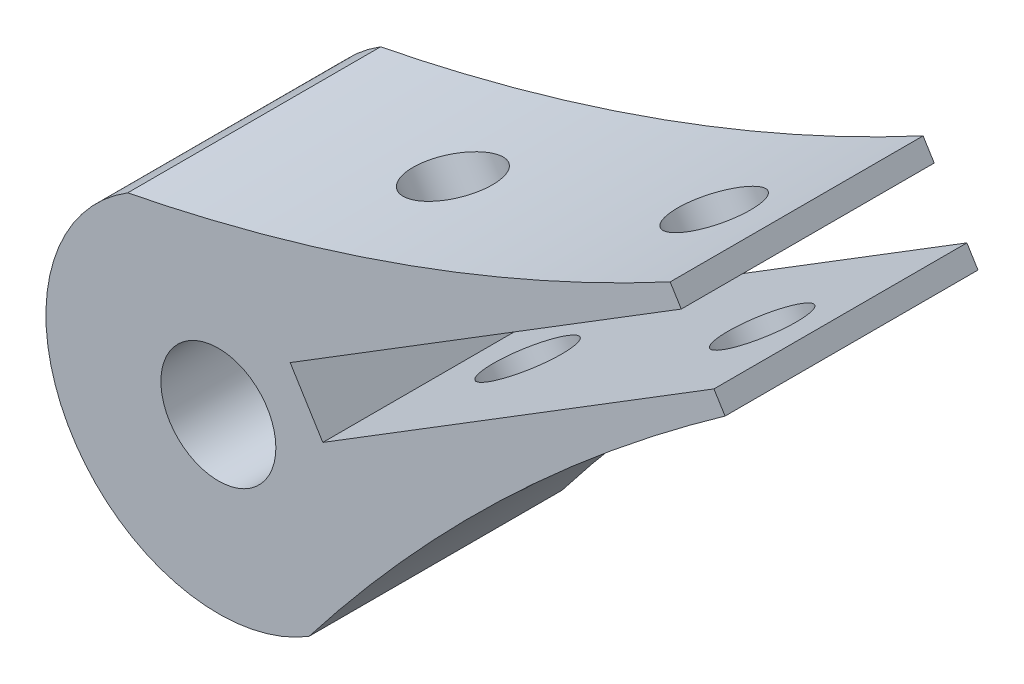
ISO-10303-21;
HEADER;
FILE_DESCRIPTION(('STEP AP214'),'2;1');
FILE_NAME('part.step','',(''),(''),'','','');
FILE_SCHEMA(('AUTOMOTIVE_DESIGN { 1 0 10303 214 1 1 1 1 }'));
ENDSEC;
DATA;
#1=APPLICATION_CONTEXT('core data for automotive mechanical design processes');
#2=APPLICATION_PROTOCOL_DEFINITION('international standard','automotive_design',2000,#1);
#3=PRODUCT_CONTEXT('',#1,'mechanical');
#4=PRODUCT('Part','Part','',(#3));
#5=PRODUCT_RELATED_PRODUCT_CATEGORY('part','',(#4));
#6=PRODUCT_DEFINITION_FORMATION('','',#4);
#7=PRODUCT_DEFINITION_CONTEXT('part definition',#1,'design');
#8=PRODUCT_DEFINITION('design','',#6,#7);
#9=PRODUCT_DEFINITION_SHAPE('','',#8);
#10=(LENGTH_UNIT() NAMED_UNIT(*) SI_UNIT(.MILLI.,.METRE.));
#11=(NAMED_UNIT(*) PLANE_ANGLE_UNIT() SI_UNIT($,.RADIAN.));
#12=(NAMED_UNIT(*) SI_UNIT($,.STERADIAN.) SOLID_ANGLE_UNIT());
#13=UNCERTAINTY_MEASURE_WITH_UNIT(LENGTH_MEASURE(1.E-05),#10,'distance_accuracy_value','');
#14=(GEOMETRIC_REPRESENTATION_CONTEXT(3) GLOBAL_UNCERTAINTY_ASSIGNED_CONTEXT((#13)) GLOBAL_UNIT_ASSIGNED_CONTEXT((#10,
#11,#12)) REPRESENTATION_CONTEXT('',''));
#15=CARTESIAN_POINT('',(0.,0.,0.));
#16=DIRECTION('',(0.,0.,1.));
#17=DIRECTION('',(1.,0.,0.));
#18=AXIS2_PLACEMENT_3D('',#15,#16,#17);
#19=CARTESIAN_POINT('',(8.17278399741559,9.72023727549129,11.));
#20=DIRECTION('',(0.,0.,-1.));
#21=DIRECTION('',(-1.,0.,0.));
#22=AXIS2_PLACEMENT_3D('',#19,#20,#21);
#23=PLANE('',#22);
#24=DIRECTION('',(-0.850473719865916,-0.526017539457984,0.));
#25=VECTOR('',#24,1.);
#26=CARTESIAN_POINT('',(21.5517653165876,11.7424046499424,11.));
#27=LINE('',#26,#25);
#28=CARTESIAN_POINT('',(21.5517653165876,11.7424046499424,11.));
#29=VERTEX_POINT('',#28);
#30=CARTESIAN_POINT('',(4.5422909192693,1.22205386078271,11.));
#31=VERTEX_POINT('',#30);
#32=EDGE_CURVE('E206',#29,#31,#27,.T.);
#33=ORIENTED_EDGE('',*,*,#32,.T.);
#34=DIRECTION('',(-0.526017539457984,0.850473719865916,0.));
#35=VECTOR('',#34,1.);
#36=CARTESIAN_POINT('',(3.12204356273275,3.51833290442068,11.));
#37=LINE('',#36,#35);
#38=CARTESIAN_POINT('',(3.12204356273275,3.51833290442068,11.));
#39=VERTEX_POINT('',#38);
#40=EDGE_CURVE('E107',#31,#39,#37,.T.);
#41=ORIENTED_EDGE('',*,*,#40,.T.);
#42=DIRECTION('',(0.850473719865916,0.526017539457984,0.));
#43=VECTOR('',#42,1.);
#44=CARTESIAN_POINT('',(20.1315179600511,14.0386836935804,11.));
#45=LINE('',#44,#43);
#46=CARTESIAN_POINT('',(20.1315179600511,14.0386836935804,11.));
#47=VERTEX_POINT('',#46);
#48=EDGE_CURVE('E203',#39,#47,#45,.T.);
#49=ORIENTED_EDGE('',*,*,#48,.T.);
#50=DIRECTION('',(-0.526017539457984,0.850473719865916,0.));
#51=VECTOR('',#50,1.);
#52=CARTESIAN_POINT('',(19.6477702099956,14.8208149299083,11.));
#53=LINE('',#52,#51);
#54=CARTESIAN_POINT('',(19.6477702099956,14.8208149299083,11.));
#55=VERTEX_POINT('',#54);
#56=EDGE_CURVE('E198',#47,#55,#53,.T.);
#57=ORIENTED_EDGE('',*,*,#56,.T.);
#58=CARTESIAN_POINT('',(19.6477702099956,14.8208149299083,11.));
#59=CARTESIAN_POINT('',(8.49425791636496,8.84079635987424,11.));
#60=CARTESIAN_POINT('',(-3.94515005306311,6.37854145230835,11.));
#61=B_SPLINE_CURVE_WITH_KNOTS('',2,(#58,#59,#60),.UNSPECIFIED.,.F.,.F.,(3,3),(0.,1.),.UNSPECIFIED.);
#62=CARTESIAN_POINT('',(-3.94515005306311,6.37854145230835,11.));
#63=VERTEX_POINT('',#62);
#64=EDGE_CURVE('E126',#55,#63,#61,.T.);
#65=ORIENTED_EDGE('',*,*,#64,.T.);
#66=CARTESIAN_POINT('',(-1.85071448418131E-05,-1.14466591639301E-05,11.));
#67=DIRECTION('',(0.,0.,1.));
#68=DIRECTION('',(1.,0.,0.));
#69=AXIS2_PLACEMENT_3D('',#66,#67,#68);
#70=CIRCLE('',#69,7.49999999996843);
#71=CARTESIAN_POINT('',(3.94511303877343,-6.37856434562668,11.));
#72=VERTEX_POINT('',#71);
#73=EDGE_CURVE('E120',#63,#72,#70,.T.);
#74=ORIENTED_EDGE('',*,*,#73,.T.);
#75=CARTESIAN_POINT('',(3.94511303877343,-6.37856434562668,11.));
#76=CARTESIAN_POINT('',(11.7037395394991,3.65165423035361,11.));
#77=CARTESIAN_POINT('',(22.0355130666431,10.9602734136144,11.));
#78=B_SPLINE_CURVE_WITH_KNOTS('',2,(#75,#76,#77),.UNSPECIFIED.,.F.,.F.,(3,3),(0.,1.),.UNSPECIFIED.);
#79=CARTESIAN_POINT('',(22.0355130666431,10.9602734136144,11.));
#80=VERTEX_POINT('',#79);
#81=EDGE_CURVE('E124',#72,#80,#78,.T.);
#82=ORIENTED_EDGE('',*,*,#81,.T.);
#83=DIRECTION('',(-0.526017539457977,0.85047371986592,0.));
#84=VECTOR('',#83,1.);
#85=CARTESIAN_POINT('',(22.0355130666431,10.9602734136144,11.));
#86=LINE('',#85,#84);
#87=EDGE_CURVE('E64',#80,#29,#86,.T.);
#88=ORIENTED_EDGE('',*,*,#87,.T.);
#89=EDGE_LOOP('',(#33,#41,#49,#57,#65,#74,#82,#88));
#90=FACE_BOUND('',#89,.T.);
#91=CARTESIAN_POINT('',(-1.85071448418131E-05,-1.14466591639301E-05,11.));
#92=DIRECTION('',(0.,0.,1.));
#93=DIRECTION('',(1.,0.,0.));
#94=AXIS2_PLACEMENT_3D('',#91,#92,#93);
#95=CIRCLE('',#94,2.5);
#96=CARTESIAN_POINT('',(2.49998149285516,-1.14466591639301E-05,11.));
#97=VERTEX_POINT('',#96);
#98=EDGE_CURVE('E211',#97,#97,#95,.T.);
#99=ORIENTED_EDGE('',*,*,#98,.F.);
#100=EDGE_LOOP('',(#99));
#101=FACE_BOUND('',#100,.T.);
#102=ADVANCED_FACE('F40',(#90,#101),#23,.F.);
#103=CARTESIAN_POINT('',(8.17278399741559,9.72023727549129,0.));
#104=DIRECTION('',(0.,0.,-1.));
#105=DIRECTION('',(-1.,0.,0.));
#106=AXIS2_PLACEMENT_3D('',#103,#104,#105);
#107=PLANE('',#106);
#108=DIRECTION('',(-0.850473719865916,-0.526017539457984,0.));
#109=VECTOR('',#108,1.);
#110=CARTESIAN_POINT('',(21.5517653165876,11.7424046499424,0.));
#111=LINE('',#110,#109);
#112=CARTESIAN_POINT('',(21.5517653165876,11.7424046499424,0.));
#113=VERTEX_POINT('',#112);
#114=CARTESIAN_POINT('',(4.5422909192693,1.22205386078271,0.));
#115=VERTEX_POINT('',#114);
#116=EDGE_CURVE('E215',#113,#115,#111,.T.);
#117=ORIENTED_EDGE('',*,*,#116,.F.);
#118=DIRECTION('',(-0.526017539457977,0.85047371986592,0.));
#119=VECTOR('',#118,1.);
#120=CARTESIAN_POINT('',(22.0355130666431,10.9602734136144,0.));
#121=LINE('',#120,#119);
#122=CARTESIAN_POINT('',(22.0355130666431,10.9602734136144,0.));
#123=VERTEX_POINT('',#122);
#124=EDGE_CURVE('E99',#123,#113,#121,.T.);
#125=ORIENTED_EDGE('',*,*,#124,.F.);
#126=CARTESIAN_POINT('',(3.94511303877343,-6.37856434562668,0.));
#127=CARTESIAN_POINT('',(11.7037395394991,3.65165423035361,0.));
#128=CARTESIAN_POINT('',(22.0355130666431,10.9602734136144,0.));
#129=B_SPLINE_CURVE_WITH_KNOTS('',2,(#126,#127,#128),.UNSPECIFIED.,.F.,.F.,(3,3),(0.,1.),.UNSPECIFIED.);
#130=CARTESIAN_POINT('',(3.94511303877343,-6.37856434562668,0.));
#131=VERTEX_POINT('',#130);
#132=EDGE_CURVE('E93',#131,#123,#129,.T.);
#133=ORIENTED_EDGE('',*,*,#132,.F.);
#134=CARTESIAN_POINT('',(-1.85071448418131E-05,-1.14466591639301E-05,0.));
#135=DIRECTION('',(0.,0.,1.));
#136=DIRECTION('',(1.,0.,0.));
#137=AXIS2_PLACEMENT_3D('',#134,#135,#136);
#138=CIRCLE('',#137,7.49999999996843);
#139=CARTESIAN_POINT('',(-3.94515005306311,6.37854145230835,0.));
#140=VERTEX_POINT('',#139);
#141=EDGE_CURVE('E134',#140,#131,#138,.T.);
#142=ORIENTED_EDGE('',*,*,#141,.F.);
#143=CARTESIAN_POINT('',(19.6477702099956,14.8208149299083,0.));
#144=CARTESIAN_POINT('',(8.49425791636496,8.84079635987424,0.));
#145=CARTESIAN_POINT('',(-3.94515005306311,6.37854145230835,0.));
#146=B_SPLINE_CURVE_WITH_KNOTS('',2,(#143,#144,#145),.UNSPECIFIED.,.F.,.F.,(3,3),(0.,1.),.UNSPECIFIED.);
#147=CARTESIAN_POINT('',(19.6477702099956,14.8208149299083,0.));
#148=VERTEX_POINT('',#147);
#149=EDGE_CURVE('E401',#148,#140,#146,.T.);
#150=ORIENTED_EDGE('',*,*,#149,.F.);
#151=DIRECTION('',(-0.526017539457984,0.850473719865916,0.));
#152=VECTOR('',#151,1.);
#153=CARTESIAN_POINT('',(19.6477702099956,14.8208149299083,0.));
#154=LINE('',#153,#152);
#155=CARTESIAN_POINT('',(20.1315179600511,14.0386836935804,0.));
#156=VERTEX_POINT('',#155);
#157=EDGE_CURVE('E399',#156,#148,#154,.T.);
#158=ORIENTED_EDGE('',*,*,#157,.F.);
#159=DIRECTION('',(0.850473719865916,0.526017539457984,0.));
#160=VECTOR('',#159,1.);
#161=CARTESIAN_POINT('',(20.1315179600511,14.0386836935804,0.));
#162=LINE('',#161,#160);
#163=CARTESIAN_POINT('',(3.12204356273275,3.51833290442068,0.));
#164=VERTEX_POINT('',#163);
#165=EDGE_CURVE('E392',#164,#156,#162,.T.);
#166=ORIENTED_EDGE('',*,*,#165,.F.);
#167=DIRECTION('',(-0.526017539457984,0.850473719865916,0.));
#168=VECTOR('',#167,1.);
#169=CARTESIAN_POINT('',(3.12204356273275,3.51833290442068,0.));
#170=LINE('',#169,#168);
#171=EDGE_CURVE('E387',#115,#164,#170,.T.);
#172=ORIENTED_EDGE('',*,*,#171,.F.);
#173=EDGE_LOOP('',(#117,#125,#133,#142,#150,#158,#166,#172));
#174=FACE_BOUND('',#173,.T.);
#175=CARTESIAN_POINT('',(-1.85071448418131E-05,-1.14466591639301E-05,0.));
#176=DIRECTION('',(0.,0.,1.));
#177=DIRECTION('',(1.,0.,0.));
#178=AXIS2_PLACEMENT_3D('',#175,#176,#177);
#179=CIRCLE('',#178,2.5);
#180=CARTESIAN_POINT('',(2.49998149285516,-1.14466591639301E-05,0.));
#181=VERTEX_POINT('',#180);
#182=EDGE_CURVE('E208',#181,#181,#179,.T.);
#183=ORIENTED_EDGE('',*,*,#182,.T.);
#184=EDGE_LOOP('',(#183));
#185=FACE_BOUND('',#184,.T.);
#186=ADVANCED_FACE('F248',(#174,#185),#107,.T.);
#187=CARTESIAN_POINT('',(21.5517653165876,11.7424046499424,11.));
#188=DIRECTION('',(0.526017539457984,-0.850473719865916,0.));
#189=DIRECTION('',(0.850473719865916,0.526017539457984,0.));
#190=AXIS2_PLACEMENT_3D('',#187,#188,#189);
#191=PLANE('',#190);
#192=CARTESIAN_POINT('',(7.94418579873295,3.32612401861464,5.5));
#193=DIRECTION('',(0.526017539457984,-0.850473719865916,0.));
#194=DIRECTION('',(0.850473719865916,0.526017539457984,0.));
#195=AXIS2_PLACEMENT_3D('',#192,#193,#194);
#196=CIRCLE('',#195,1.75);
#197=CARTESIAN_POINT('',(9.43251480849831,4.24665471266611,5.5));
#198=VERTEX_POINT('',#197);
#199=EDGE_CURVE('E212',#198,#198,#196,.T.);
#200=ORIENTED_EDGE('',*,*,#199,.T.);
#201=EDGE_LOOP('',(#200));
#202=FACE_BOUND('',#201,.T.);
#203=CARTESIAN_POINT('',(18.1498704371239,9.63833449211044,5.5));
#204=DIRECTION('',(0.526017539457984,-0.850473719865916,0.));
#205=DIRECTION('',(0.850473719865916,0.526017539457984,0.));
#206=AXIS2_PLACEMENT_3D('',#203,#204,#205);
#207=CIRCLE('',#206,1.75);
#208=CARTESIAN_POINT('',(19.6381994468893,10.5588651861619,5.5));
#209=VERTEX_POINT('',#208);
#210=EDGE_CURVE('E226',#209,#209,#207,.T.);
#211=ORIENTED_EDGE('',*,*,#210,.T.);
#212=EDGE_LOOP('',(#211));
#213=FACE_BOUND('',#212,.T.);
#214=ORIENTED_EDGE('',*,*,#116,.T.);
#215=DIRECTION('',(0.,0.,-1.));
#216=VECTOR('',#215,1.);
#217=CARTESIAN_POINT('',(4.5422909192693,1.22205386078271,11.));
#218=LINE('',#217,#216);
#219=EDGE_CURVE('E11',#31,#115,#218,.T.);
#220=ORIENTED_EDGE('',*,*,#219,.F.);
#221=ORIENTED_EDGE('',*,*,#32,.F.);
#222=DIRECTION('',(0.,0.,-1.));
#223=VECTOR('',#222,1.);
#224=CARTESIAN_POINT('',(21.5517653165876,11.7424046499424,11.));
#225=LINE('',#224,#223);
#226=EDGE_CURVE('E140',#29,#113,#225,.T.);
#227=ORIENTED_EDGE('',*,*,#226,.T.);
#228=EDGE_LOOP('',(#214,#220,#221,#227));
#229=FACE_BOUND('',#228,.T.);
#230=ADVANCED_FACE('F42',(#202,#213,#229),#191,.F.);
#231=CARTESIAN_POINT('',(3.12204356273275,3.51833290442068,11.));
#232=DIRECTION('',(-0.850473719865916,-0.526017539457984,0.));
#233=DIRECTION('',(0.526017539457984,-0.850473719865916,0.));
#234=AXIS2_PLACEMENT_3D('',#231,#232,#233);
#235=PLANE('',#234);
#236=ORIENTED_EDGE('',*,*,#171,.T.);
#237=DIRECTION('',(0.,0.,-1.));
#238=VECTOR('',#237,1.);
#239=CARTESIAN_POINT('',(3.12204356273275,3.51833290442068,11.));
#240=LINE('',#239,#238);
#241=EDGE_CURVE('E55',#39,#164,#240,.T.);
#242=ORIENTED_EDGE('',*,*,#241,.F.);
#243=ORIENTED_EDGE('',*,*,#40,.F.);
#244=ORIENTED_EDGE('',*,*,#219,.T.);
#245=EDGE_LOOP('',(#236,#242,#243,#244));
#246=FACE_BOUND('',#245,.T.);
#247=ADVANCED_FACE('F256',(#246),#235,.F.);
#248=CARTESIAN_POINT('',(20.1315179600511,14.0386836935804,11.));
#249=DIRECTION('',(-0.526017539457984,0.850473719865916,0.));
#250=DIRECTION('',(-0.850473719865916,-0.526017539457984,0.));
#251=AXIS2_PLACEMENT_3D('',#248,#249,#250);
#252=PLANE('',#251);
#253=CARTESIAN_POINT('',(6.52393844219642,5.62240306225262,5.5));
#254=DIRECTION('',(-0.526017539457984,0.850473719865916,0.));
#255=DIRECTION('',(-0.850473719865916,-0.526017539457984,0.));
#256=AXIS2_PLACEMENT_3D('',#253,#254,#255);
#257=CIRCLE('',#256,1.75);
#258=CARTESIAN_POINT('',(5.03560943243107,4.70187236820114,5.5));
#259=VERTEX_POINT('',#258);
#260=EDGE_CURVE('E218',#259,#259,#257,.T.);
#261=ORIENTED_EDGE('',*,*,#260,.T.);
#262=EDGE_LOOP('',(#261));
#263=FACE_BOUND('',#262,.T.);
#264=CARTESIAN_POINT('',(16.7296230805874,11.9346135357484,5.5));
#265=DIRECTION('',(-0.526017539457984,0.850473719865916,0.));
#266=DIRECTION('',(-0.850473719865916,-0.526017539457984,0.));
#267=AXIS2_PLACEMENT_3D('',#264,#265,#266);
#268=CIRCLE('',#267,1.75);
#269=CARTESIAN_POINT('',(15.2412940708221,11.014082841697,5.5));
#270=VERTEX_POINT('',#269);
#271=EDGE_CURVE('E184',#270,#270,#268,.T.);
#272=ORIENTED_EDGE('',*,*,#271,.T.);
#273=EDGE_LOOP('',(#272));
#274=FACE_BOUND('',#273,.T.);
#275=ORIENTED_EDGE('',*,*,#165,.T.);
#276=DIRECTION('',(0.,0.,-1.));
#277=VECTOR('',#276,1.);
#278=CARTESIAN_POINT('',(20.1315179600511,14.0386836935804,11.));
#279=LINE('',#278,#277);
#280=EDGE_CURVE('E396',#47,#156,#279,.T.);
#281=ORIENTED_EDGE('',*,*,#280,.F.);
#282=ORIENTED_EDGE('',*,*,#48,.F.);
#283=ORIENTED_EDGE('',*,*,#241,.T.);
#284=EDGE_LOOP('',(#275,#281,#282,#283));
#285=FACE_BOUND('',#284,.T.);
#286=ADVANCED_FACE('F234',(#263,#274,#285),#252,.F.);
#287=CARTESIAN_POINT('',(19.6477702099956,14.8208149299083,11.));
#288=DIRECTION('',(-0.850473719865916,-0.526017539457984,0.));
#289=DIRECTION('',(0.526017539457984,-0.850473719865916,0.));
#290=AXIS2_PLACEMENT_3D('',#287,#288,#289);
#291=PLANE('',#290);
#292=ORIENTED_EDGE('',*,*,#157,.T.);
#293=DIRECTION('',(0.,0.,-1.));
#294=VECTOR('',#293,1.);
#295=CARTESIAN_POINT('',(19.6477702099956,14.8208149299083,11.));
#296=LINE('',#295,#294);
#297=EDGE_CURVE('E421',#55,#148,#296,.T.);
#298=ORIENTED_EDGE('',*,*,#297,.F.);
#299=ORIENTED_EDGE('',*,*,#56,.F.);
#300=ORIENTED_EDGE('',*,*,#280,.T.);
#301=EDGE_LOOP('',(#292,#298,#299,#300));
#302=FACE_BOUND('',#301,.T.);
#303=ADVANCED_FACE('F190',(#302),#291,.F.);
#304=DIRECTION('',(0.,0.,-1.));
#305=VECTOR('',#304,1.);
#306=SURFACE_OF_LINEAR_EXTRUSION('',#61,#305);
#307=CARTESIAN_POINT('',(6.42129281072394,9.115247452802,5.5));
#308=CARTESIAN_POINT('',(6.42128842378051,9.11524583152748,5.59629175401636));
#309=CARTESIAN_POINT('',(6.41351542309201,9.11265552252664,5.69265507389164));
#310=CARTESIAN_POINT('',(6.38264528607691,9.10238291211998,5.88269507144255));
#311=CARTESIAN_POINT('',(6.3595294403216,9.09469439384812,5.97636832310926));
#312=CARTESIAN_POINT('',(6.29873017467823,9.07452058162893,6.15821119789269));
#313=CARTESIAN_POINT('',(6.2610614433834,9.06204012438418,6.24638626657586));
#314=CARTESIAN_POINT('',(6.17233670165222,9.03273925967902,6.41489455831636));
#315=CARTESIAN_POINT('',(6.12128348996876,9.01591975954303,6.49522941598226));
#316=CARTESIAN_POINT('',(6.00668279262741,8.97831622550669,6.64682701593102));
#317=CARTESIAN_POINT('',(5.94300307805423,8.95749031048253,6.71797931946707));
#318=CARTESIAN_POINT('',(5.80538275709451,8.91269615865962,6.84837131387819));
#319=CARTESIAN_POINT('',(5.73144065817694,8.88872746481243,6.90760926889063));
#320=CARTESIAN_POINT('',(5.57335787701025,8.8377556694768,7.01412788040748));
#321=CARTESIAN_POINT('',(5.4890040507894,8.81069044905339,7.06106239331767));
#322=CARTESIAN_POINT('',(5.31404467304979,8.75488432322532,7.1398569492338));
#323=CARTESIAN_POINT('',(5.22343820980937,8.7261431735419,7.17171478850619));
#324=CARTESIAN_POINT('',(5.03582586664246,8.66699861299795,7.22035204369118));
#325=CARTESIAN_POINT('',(4.93871197235725,8.63657119746586,7.2366859780213));
#326=CARTESIAN_POINT('',(4.74312759903368,8.57568944901466,7.25239423117256));
#327=CARTESIAN_POINT('',(4.64465695151389,8.54523511320015,7.25176642436552));
#328=CARTESIAN_POINT('',(4.44715826585757,8.48454920342921,7.23343432684378));
#329=CARTESIAN_POINT('',(4.34815563022833,8.45433304858208,7.21540343673205));
#330=CARTESIAN_POINT('',(4.15433168775172,8.39555402579789,7.16223541903419));
#331=CARTESIAN_POINT('',(4.05951057767081,8.36699123564206,7.12709748739135));
#332=CARTESIAN_POINT('',(3.87681135123616,8.31228531499911,7.04055483367671));
#333=CARTESIAN_POINT('',(3.78893462565861,8.28614266902387,6.98914686341328));
#334=CARTESIAN_POINT('',(3.62287051684432,8.23700466867641,6.87134144348725));
#335=CARTESIAN_POINT('',(3.54468218856136,8.21400900731142,6.80494545760315));
#336=CARTESIAN_POINT('',(3.40218402578295,8.17229048406121,6.6605339719113));
#337=CARTESIAN_POINT('',(3.33760543185762,8.15348435192043,6.58280801682779));
#338=CARTESIAN_POINT('',(3.22241799536248,8.12005859899719,6.4168131220747));
#339=CARTESIAN_POINT('',(3.17180609081245,8.10543806056183,6.32854649937248));
#340=CARTESIAN_POINT('',(3.08794269773076,8.08127119401404,6.14735870671153));
#341=CARTESIAN_POINT('',(3.05413598537138,8.07156236165695,6.05471616820669));
#342=CARTESIAN_POINT('',(3.00248448914413,8.05674739477633,5.8647345183304));
#343=CARTESIAN_POINT('',(2.98463639855726,8.051640306743,5.76739638432114));
#344=CARTESIAN_POINT('',(2.96586738910532,8.04627023444459,5.57400029988635));
#345=CARTESIAN_POINT('',(2.96444341349815,8.04586328826955,5.47799485160935));
#346=CARTESIAN_POINT('',(2.97726989166485,8.04953241117596,5.28712966964212));
#347=CARTESIAN_POINT('',(2.99151908857194,8.05360812078321,5.19226984469847));
#348=CARTESIAN_POINT('',(3.03497878446239,8.06606479584953,5.00725234457556));
#349=CARTESIAN_POINT('',(3.06405367120481,8.07440673959608,4.91706007182047));
#350=CARTESIAN_POINT('',(3.13609379668479,8.09513857588052,4.74291159414927));
#351=CARTESIAN_POINT('',(3.17905986222328,8.10752870936653,4.65895576079099));
#352=CARTESIAN_POINT('',(3.27832374639871,8.13626499367987,4.49808887970605));
#353=CARTESIAN_POINT('',(3.33483396177802,8.1526742723817,4.42132033679015));
#354=CARTESIAN_POINT('',(3.45901586475238,8.18890435585797,4.27835019885817));
#355=CARTESIAN_POINT('',(3.52668925851497,8.2087256821461,4.21215022217801));
#356=CARTESIAN_POINT('',(3.67364351918869,8.25199791777667,4.08983996233784));
#357=CARTESIAN_POINT('',(3.75323574359712,8.27554767060363,4.03413881110368));
#358=CARTESIAN_POINT('',(3.91994459111879,8.32516967925416,3.93693170476916));
#359=CARTESIAN_POINT('',(4.00706252740541,8.35124237540587,3.89542823333654));
#360=CARTESIAN_POINT('',(4.18945015061109,8.40617190323915,3.82640578193382));
#361=CARTESIAN_POINT('',(4.28489481057927,8.43509259019005,3.79939939376147));
#362=CARTESIAN_POINT('',(4.47863114474144,8.494187862532,3.76216869552129));
#363=CARTESIAN_POINT('',(4.5769231785227,8.52436260650557,3.75194651457156));
#364=CARTESIAN_POINT('',(4.77547756469699,8.58572026264499,3.7485281182658));
#365=CARTESIAN_POINT('',(4.87574298210318,8.61691151459414,3.75564769905205));
#366=CARTESIAN_POINT('',(5.07359024203784,8.67885927768175,3.78746892397646));
#367=CARTESIAN_POINT('',(5.171172045519,8.70961578249136,3.81217082380169));
#368=CARTESIAN_POINT('',(5.36047385276491,8.76964387233552,3.87849865955825));
#369=CARTESIAN_POINT('',(5.45221354972722,8.79892036905433,3.92006382794403));
#370=CARTESIAN_POINT('',(5.62744314931704,8.8551464221712,4.01911666951122));
#371=CARTESIAN_POINT('',(5.71093423264361,8.88209631152784,4.07660205939351));
#372=CARTESIAN_POINT('',(5.86532827191572,8.93216799510883,4.20456869010876));
#373=CARTESIAN_POINT('',(5.9364669279476,8.95536071793224,4.27473764135234));
#374=CARTESIAN_POINT('',(6.06609521972357,8.99778180948731,4.42699404266396));
#375=CARTESIAN_POINT('',(6.12458367272658,9.01700980752594,4.5090826059677));
#376=CARTESIAN_POINT('',(6.22548885016382,9.0502757577324,4.68030751033595));
#377=CARTESIAN_POINT('',(6.26831501426126,9.06444565556501,4.76917732254395));
#378=CARTESIAN_POINT('',(6.33873112959474,9.08778523036037,4.95328516259828));
#379=CARTESIAN_POINT('',(6.36634269712648,9.09696200112604,5.04851393893141));
#380=CARTESIAN_POINT('',(6.39766114328369,9.10737883604075,5.20370432106145));
#381=CARTESIAN_POINT('',(6.40651069160543,9.11032485511583,5.26256633998223));
#382=CARTESIAN_POINT('',(6.41832784300957,9.11425965189342,5.38094312373072));
#383=CARTESIAN_POINT('',(6.4212955233956,9.11524845531902,5.44045787996937));
#384=CARTESIAN_POINT('',(6.42129281072394,9.115247452802,5.5));
#385=B_SPLINE_CURVE_WITH_KNOTS('',3,(#307,#308,#309,#310,#311,#312,#313,#314,#315,#316,#317,
#318,#319,#320,#321,#322,#323,#324,#325,#326,#327,#328,#329,#330,#331,#332,#333,#334,#335,#336,
#337,#338,#339,#340,#341,#342,#343,#344,#345,#346,#347,#348,#349,#350,#351,#352,#353,#354,#355,
#356,#357,#358,#359,#360,#361,#362,#363,#364,#365,#366,#367,#368,#369,#370,#371,#372,#373,#374,
#375,#376,#377,#378,#379,#380,#381,#382,#383,#384),.UNSPECIFIED.,.T.,.F.,(4,2,2,2,2,2,2,2,2,2,2,
2,2,2,2,2,2,2,2,2,2,2,2,2,2,2,2,2,2,2,2,2,2,2,2,2,2,2,4),(0.,0.288654871648949,
0.577662384162045,0.866378953015614,1.15503519806887,1.44689127801059,1.73878984921009,
2.03818466693042,2.33762323321199,2.64541604862628,2.95324743650269,3.26697045512736,
3.58070822062977,3.89450866108516,4.2082784680149,4.51510695628577,4.82186812362785,
5.11767877994643,5.41342812836737,5.70009396987458,5.98673682468236,6.27080354167839,
6.55488716939743,6.84375654810738,7.13267011826295,7.43119926188959,7.72978060196717,
8.03832048366934,8.3468995013938,8.66113966082684,8.97538439012275,9.28850664252883,
9.60158400976544,9.90780276514862,10.2140501383405,10.5115958338457,10.8087176909941,
10.9872101183092,11.1657001997364),.UNSPECIFIED.);
#386=CARTESIAN_POINT('',(6.42129281072394,9.115247452802,5.5));
#387=VERTEX_POINT('',#386);
#388=EDGE_CURVE('E221',#387,#387,#385,.T.);
#389=ORIENTED_EDGE('',*,*,#388,.T.);
#390=EDGE_LOOP('',(#389));
#391=FACE_BOUND('',#390,.T.);
#392=CARTESIAN_POINT('',(17.6454327122743,13.7808028792652,5.5));
#393=CARTESIAN_POINT('',(17.6454288631167,13.7808007737014,5.59799745360672));
#394=CARTESIAN_POINT('',(17.6380253235818,13.7770769530911,5.69606583038364));
#395=CARTESIAN_POINT('',(17.6085916877132,13.7622881500489,5.88949722752227));
#396=CARTESIAN_POINT('',(17.5865440480739,13.7512143625319,5.98485685981539));
#397=CARTESIAN_POINT('',(17.5284444868367,13.7220849490391,6.1700363666668));
#398=CARTESIAN_POINT('',(17.4924001707765,13.7040331148302,6.25985921914748));
#399=CARTESIAN_POINT('',(17.4073265632813,13.6615295604722,6.43144999232908));
#400=CARTESIAN_POINT('',(17.3583004355328,13.6370793996217,6.51321986889996));
#401=CARTESIAN_POINT('',(17.248544693822,13.582506800838,6.66655923717852));
#402=CARTESIAN_POINT('',(17.1877969270923,13.5523755665625,6.73811260403941));
#403=CARTESIAN_POINT('',(17.0563447813347,13.4874035315047,6.86887387979534));
#404=CARTESIAN_POINT('',(16.9856398589799,13.4525624737282,6.92808111456792));
#405=CARTESIAN_POINT('',(16.8359686365217,13.379098651864,7.03270978052183));
#406=CARTESIAN_POINT('',(16.7569725377858,13.3404622815952,7.07807902687255));
#407=CARTESIAN_POINT('',(16.5931498056749,13.2606779029667,7.15349226807643));
#408=CARTESIAN_POINT('',(16.5083230316729,13.2195298340314,7.1835358931515));
#409=CARTESIAN_POINT('',(16.334790465505,13.1357255202351,7.22759741566424));
#410=CARTESIAN_POINT('',(16.2460680369111,13.0930629945158,7.24153784881087));
#411=CARTESIAN_POINT('',(16.0676199136702,13.0076442445422,7.25277003085502));
#412=CARTESIAN_POINT('',(15.9778941938266,12.9648880179565,7.25006136068641));
#413=CARTESIAN_POINT('',(15.799599537621,12.8803070917694,7.22804204363373));
#414=CARTESIAN_POINT('',(15.7110368137471,12.8384869039939,7.20866371278509));
#415=CARTESIAN_POINT('',(15.5379659930931,12.757113467074,7.15376009218293));
#416=CARTESIAN_POINT('',(15.4534579556485,12.7175602511023,7.11823456621357));
#417=CARTESIAN_POINT('',(15.2908469195433,12.641756128737,7.0319792382889));
#418=CARTESIAN_POINT('',(15.2127501871905,12.605508449377,6.98123478173601));
#419=CARTESIAN_POINT('',(15.0653348835493,12.5373317984416,6.86596243244036));
#420=CARTESIAN_POINT('',(14.9960161869443,12.5054027652122,6.80143473650448));
#421=CARTESIAN_POINT('',(14.8684550629846,12.4468244739816,6.66066263221));
#422=CARTESIAN_POINT('',(14.8101726273458,12.4201561298278,6.58446243028281));
#423=CARTESIAN_POINT('',(14.7061259201182,12.3726606736286,6.42231686927009));
#424=CARTESIAN_POINT('',(14.6603611466765,12.3518333274075,6.33637190106319));
#425=CARTESIAN_POINT('',(14.583038216547,12.3167024826092,6.15784063738767));
#426=CARTESIAN_POINT('',(14.5513795807856,12.3023528329654,6.06530694299482));
#427=CARTESIAN_POINT('',(14.502764299589,12.2803369304418,5.87569446302495));
#428=CARTESIAN_POINT('',(14.4858070087064,12.2726703841471,5.77861587718394));
#429=CARTESIAN_POINT('',(14.4671866663217,12.2642527346616,5.58338099364166));
#430=CARTESIAN_POINT('',(14.4654198408886,12.263454709011,5.4852366021335));
#431=CARTESIAN_POINT('',(14.4769626428612,12.2686718844698,5.29002292402159));
#432=CARTESIAN_POINT('',(14.4902719770706,12.2746869530803,5.19295361654702));
#433=CARTESIAN_POINT('',(14.5315107942867,12.2933519243714,5.00285719539406));
#434=CARTESIAN_POINT('',(14.5594088059361,12.3059875450116,4.90982184550208));
#435=CARTESIAN_POINT('',(14.6289568286431,12.3375561102378,4.73018391277477));
#436=CARTESIAN_POINT('',(14.6706070510371,12.356489151599,4.64358142882129));
#437=CARTESIAN_POINT('',(14.7666004677506,12.4002486846865,4.47889005246109));
#438=CARTESIAN_POINT('',(14.8209926352959,12.4250979212752,4.40083575766256));
#439=CARTESIAN_POINT('',(14.940772270369,12.4800062216791,4.25577992676387));
#440=CARTESIAN_POINT('',(15.0061601675847,12.5100654890919,4.18877882279977));
#441=CARTESIAN_POINT('',(15.1465577750509,12.5748571089543,4.06720152742227));
#442=CARTESIAN_POINT('',(15.2216352959403,12.6096224889523,4.01272124377179));
#443=CARTESIAN_POINT('',(15.3788630200757,12.6827379168379,3.91831616038155));
#444=CARTESIAN_POINT('',(15.4610134864145,12.7210880980741,3.87839190237251));
#445=CARTESIAN_POINT('',(15.6306048162737,12.8006126820263,3.8139796436992));
#446=CARTESIAN_POINT('',(15.7180766087883,12.8418038286449,3.78959371187397));
#447=CARTESIAN_POINT('',(15.8953315342596,12.9256589194177,3.75735251553901));
#448=CARTESIAN_POINT('',(15.9851147133925,12.9683228930015,3.74949758154049));
#449=CARTESIAN_POINT('',(16.1646639601639,13.0540326324743,3.75055352579575));
#450=CARTESIAN_POINT('',(16.2544294816374,13.0970790641016,3.75950423275303));
#451=CARTESIAN_POINT('',(16.4311787960317,13.1822123405493,3.79402344096753));
#452=CARTESIAN_POINT('',(16.518162602594,13.2242991900752,3.81959186071877));
#453=CARTESIAN_POINT('',(16.6867027375333,13.3061835559579,3.88658460925323));
#454=CARTESIAN_POINT('',(16.7682697309786,13.3459855486213,3.92797662712495));
#455=CARTESIAN_POINT('',(16.9238468573371,13.4221845913778,4.02547446351082));
#456=CARTESIAN_POINT('',(16.9978574535478,13.4585818502102,4.08157937919495));
#457=CARTESIAN_POINT('',(17.1358942422055,13.5266848898305,4.20663549392608));
#458=CARTESIAN_POINT('',(17.1999650183909,13.5584115849952,4.27552609459612));
#459=CARTESIAN_POINT('',(17.3167292635658,13.6163830142797,4.42440180791747));
#460=CARTESIAN_POINT('',(17.369420182014,13.6426265194218,4.50438940112817));
#461=CARTESIAN_POINT('',(17.4617122315198,13.6886849171302,4.67280200252424));
#462=CARTESIAN_POINT('',(17.5013668764236,13.7085260849082,4.76119054684755));
#463=CARTESIAN_POINT('',(17.5667303347749,13.7412722301131,4.94410494218878));
#464=CARTESIAN_POINT('',(17.5924561842112,13.7541856804935,5.03862313693014));
#465=CARTESIAN_POINT('',(17.6223574090549,13.7692036823596,5.19479365790434));
#466=CARTESIAN_POINT('',(17.6309999060171,13.7735473060632,5.25542067146369));
#467=CARTESIAN_POINT('',(17.6425387569503,13.7793475608037,5.37735586297177));
#468=CARTESIAN_POINT('',(17.6454351214367,13.7808041971237,5.43866403967377));
#469=CARTESIAN_POINT('',(17.6454327122743,13.7808028792652,5.5));
#470=B_SPLINE_CURVE_WITH_KNOTS('',3,(#392,#393,#394,#395,#396,#397,#398,#399,#400,#401,#402,
#403,#404,#405,#406,#407,#408,#409,#410,#411,#412,#413,#414,#415,#416,#417,#418,#419,#420,#421,
#422,#423,#424,#425,#426,#427,#428,#429,#430,#431,#432,#433,#434,#435,#436,#437,#438,#439,#440,
#441,#442,#443,#444,#445,#446,#447,#448,#449,#450,#451,#452,#453,#454,#455,#456,#457,#458,#459,
#460,#461,#462,#463,#464,#465,#466,#467,#468,#469),.UNSPECIFIED.,.T.,.F.,(4,2,2,2,2,2,2,2,2,2,2,
2,2,2,2,2,2,2,2,2,2,2,2,2,2,2,2,2,2,2,2,2,2,2,2,2,2,2,4),(0.,0.293768134141782,
0.587888832243921,0.88184993368504,1.17573946220719,1.47008783086327,1.76445226729788,
2.05991344247278,2.35538174622677,2.65226555563856,2.949156837793,3.24725931083798,
3.54536614493727,3.843760958468,4.14215151159091,4.43943872413186,4.73671401620904,
5.03183655124144,5.3269461285694,5.62003804411624,5.91312425980003,6.20558080908053,
6.49804185288397,6.79164595725099,7.08526153765877,7.38105631613425,7.67686210206228,
7.97459148521105,8.27232682093245,8.57076866841022,8.86920905211185,9.16704326428342,
9.46485920467893,9.76129809848352,10.0578033636627,10.3530758189731,10.6479863128263,
10.8318541882848,11.0157217272634),.UNSPECIFIED.);
#471=CARTESIAN_POINT('',(17.6454327122743,13.7808028792652,5.5));
#472=VERTEX_POINT('',#471);
#473=EDGE_CURVE('E165',#472,#472,#470,.T.);
#474=ORIENTED_EDGE('',*,*,#473,.T.);
#475=EDGE_LOOP('',(#474));
#476=FACE_BOUND('',#475,.T.);
#477=ORIENTED_EDGE('',*,*,#149,.T.);
#478=DIRECTION('',(0.,0.,-1.));
#479=VECTOR('',#478,1.);
#480=CARTESIAN_POINT('',(-3.94515005306311,6.37854145230835,11.));
#481=LINE('',#480,#479);
#482=EDGE_CURVE('E135',#63,#140,#481,.T.);
#483=ORIENTED_EDGE('',*,*,#482,.F.);
#484=ORIENTED_EDGE('',*,*,#64,.F.);
#485=ORIENTED_EDGE('',*,*,#297,.T.);
#486=EDGE_LOOP('',(#477,#483,#484,#485));
#487=FACE_BOUND('',#486,.T.);
#488=ADVANCED_FACE('F186',(#391,#476,#487),#306,.F.);
#489=CARTESIAN_POINT('',(-1.85071448418131E-05,-1.14466591639301E-05,11.));
#490=DIRECTION('',(0.,0.,-1.));
#491=DIRECTION('',(-1.,0.,0.));
#492=AXIS2_PLACEMENT_3D('',#489,#490,#491);
#493=CYLINDRICAL_SURFACE('',#492,7.49999999996843);
#494=ORIENTED_EDGE('',*,*,#141,.T.);
#495=DIRECTION('',(0.,0.,-1.));
#496=VECTOR('',#495,1.);
#497=CARTESIAN_POINT('',(3.94511303877343,-6.37856434562668,11.));
#498=LINE('',#497,#496);
#499=EDGE_CURVE('E131',#72,#131,#498,.T.);
#500=ORIENTED_EDGE('',*,*,#499,.F.);
#501=ORIENTED_EDGE('',*,*,#73,.F.);
#502=ORIENTED_EDGE('',*,*,#482,.T.);
#503=EDGE_LOOP('',(#494,#500,#501,#502));
#504=FACE_BOUND('',#503,.T.);
#505=ADVANCED_FACE('F132',(#504),#493,.T.);
#506=DIRECTION('',(0.,0.,-1.));
#507=VECTOR('',#506,1.);
#508=SURFACE_OF_LINEAR_EXTRUSION('',#78,#507);
#509=CARTESIAN_POINT('',(11.0234894497361,1.67434101616819,5.5));
#510=CARTESIAN_POINT('',(11.0234860398785,1.67433781512544,5.40370824598364));
#511=CARTESIAN_POINT('',(11.0176969090429,1.6685399530547,5.30734492610836));
#512=CARTESIAN_POINT('',(10.9947187692208,1.64550743312714,5.11730492855745));
#513=CARTESIAN_POINT('',(10.9775158419905,1.62825881193845,5.02363167689074));
#514=CARTESIAN_POINT('',(10.9323121368717,1.5828698436118,4.84178880210731));
#515=CARTESIAN_POINT('',(10.904322246606,1.55474047864719,4.75361373342414));
#516=CARTESIAN_POINT('',(10.8384804828717,1.48844204264686,4.58510544168364));
#517=CARTESIAN_POINT('',(10.8006306711659,1.45027507051309,4.50477058401774));
#518=CARTESIAN_POINT('',(10.7158037862491,1.36453275191566,4.35317298406898));
#519=CARTESIAN_POINT('',(10.6687301859153,1.31685780108898,4.28202068053293));
#520=CARTESIAN_POINT('',(10.5671888332409,1.21373058607939,4.15162868612181));
#521=CARTESIAN_POINT('',(10.5127200053852,1.15827719060979,4.09239073110937));
#522=CARTESIAN_POINT('',(10.3965125791434,1.03960063981992,3.98587211959252));
#523=CARTESIAN_POINT('',(10.3346232087322,0.976214521585903,3.93893760668233));
#524=CARTESIAN_POINT('',(10.2065530954352,0.844597069783121,3.8601430507662));
#525=CARTESIAN_POINT('',(10.1403717268012,0.776365029568885,3.82828521149381));
#526=CARTESIAN_POINT('',(10.0036636671017,0.634917594937821,3.77964795630882));
#527=CARTESIAN_POINT('',(9.93306725796874,0.561616277782327,3.7633140219787));
#528=CARTESIAN_POINT('',(9.79124449015399,0.413811890458373,3.74760576882744));
#529=CARTESIAN_POINT('',(9.72001805363593,0.339308670837944,3.74823357563448));
#530=CARTESIAN_POINT('',(9.57751555507878,0.189704030583463,3.76656567315622));
#531=CARTESIAN_POINT('',(9.50626463399304,0.114618451943397,3.78459656326794));
#532=CARTESIAN_POINT('',(9.36710946205269,-0.0325499288960287,3.83776458096581));
#533=CARTESIAN_POINT('',(9.29920536866925,-0.104632589780842,3.87290251260864));
#534=CARTESIAN_POINT('',(9.16866293765145,-0.24366646621811,3.95944516632329));
#535=CARTESIAN_POINT('',(9.1060256546596,-0.310616653792297,4.01085313658672));
#536=CARTESIAN_POINT('',(8.9878944269917,-0.437253316588286,4.12865855651275));
#537=CARTESIAN_POINT('',(8.93239978557244,-0.496940500263222,4.19505454239685));
#538=CARTESIAN_POINT('',(8.83143178619218,-0.605805667688564,4.3394660280887));
#539=CARTESIAN_POINT('',(8.78576389304276,-0.655186928656286,4.41719198317221));
#540=CARTESIAN_POINT('',(8.70441294243022,-0.743320062716325,4.5831868779253));
#541=CARTESIAN_POINT('',(8.66872769640284,-0.782074265614672,4.67145350062752));
#542=CARTESIAN_POINT('',(8.60965059778207,-0.84631601649729,4.85264129328847));
#543=CARTESIAN_POINT('',(8.58586537893804,-0.872227762691439,4.94528383179331));
#544=CARTESIAN_POINT('',(8.54954187912161,-0.911825283665266,5.1352654816696));
#545=CARTESIAN_POINT('',(8.53700126819969,-0.925513591211582,5.23260361567886));
#546=CARTESIAN_POINT('',(8.52381406525909,-0.939908419133455,5.42599970011365));
#547=CARTESIAN_POINT('',(8.52281399573858,-0.941000743569389,5.52200514839065));
#548=CARTESIAN_POINT('',(8.53182531090103,-0.931163203017698,5.71287033035789));
#549=CARTESIAN_POINT('',(8.54183581262163,-0.920234302039038,5.80773015530153));
#550=CARTESIAN_POINT('',(8.57239073334904,-0.886912976436045,5.99274765542444));
#551=CARTESIAN_POINT('',(8.59283967259813,-0.864624460376383,6.08293992817953));
#552=CARTESIAN_POINT('',(8.64356295031288,-0.809427197647436,6.25708840585073));
#553=CARTESIAN_POINT('',(8.67383787362009,-0.776517818826162,6.341044239209));
#554=CARTESIAN_POINT('',(8.74388138932579,-0.700537567146436,6.50191112029394));
#555=CARTESIAN_POINT('',(8.78380132275496,-0.657304850544989,6.57867966320984));
#556=CARTESIAN_POINT('',(8.87167841549445,-0.562376558941878,6.72164980114182));
#557=CARTESIAN_POINT('',(8.91963680341112,-0.510679690297818,6.78784977782198));
#558=CARTESIAN_POINT('',(9.02398509581911,-0.398521431671161,6.91016003766216));
#559=CARTESIAN_POINT('',(9.08060249407534,-0.337825605956475,6.96586118889632));
#560=CARTESIAN_POINT('',(9.19945472507571,-0.21082824074462,7.06306829523084));
#561=CARTESIAN_POINT('',(9.26169053827164,-0.144525722969646,7.10457176666346));
#562=CARTESIAN_POINT('',(9.39229387148573,-0.00587051217692688,7.17359421806618));
#563=CARTESIAN_POINT('',(9.46079666951855,0.0666102156879949,7.20060060623853));
#564=CARTESIAN_POINT('',(9.60019567200697,0.213558970337356,7.23783130447871));
#565=CARTESIAN_POINT('',(9.67109217894649,0.288027248029949,7.24805348542843));
#566=CARTESIAN_POINT('',(9.81466719547979,0.438276443912774,7.2514718817342));
#567=CARTESIAN_POINT('',(9.88735453578165,0.514056379816909,7.24435230094795));
#568=CARTESIAN_POINT('',(10.0311417272097,0.663409341610271,7.21253107602354));
#569=CARTESIAN_POINT('',(10.1022415552343,0.736982335389304,7.18782917619831));
#570=CARTESIAN_POINT('',(10.2404946669073,0.879546787163326,7.12150134044175));
#571=CARTESIAN_POINT('',(10.3076611403787,0.948553671604579,7.07993617205597));
#572=CARTESIAN_POINT('',(10.4362276585343,1.08022535432665,6.98088333048878));
#573=CARTESIAN_POINT('',(10.4976285284392,1.1428910603092,6.92339794060649));
#574=CARTESIAN_POINT('',(10.611383166261,1.25866918964903,6.79543130989124));
#575=CARTESIAN_POINT('',(10.6639056622686,1.31196082301785,6.72526235864765));
#576=CARTESIAN_POINT('',(10.759754442116,1.40899717929342,6.57300595733604));
#577=CARTESIAN_POINT('',(10.8030798660611,1.45274100952401,6.4909173940323));
#578=CARTESIAN_POINT('',(10.8779092213021,1.52816677349751,6.31969248966404));
#579=CARTESIAN_POINT('',(10.9097140684005,1.56015611604996,6.23082267745604));
#580=CARTESIAN_POINT('',(10.9620452623132,1.61273568616948,6.04671483740172));
#581=CARTESIAN_POINT('',(10.9825876102306,1.6333420862745,5.95148606106858));
#582=CARTESIAN_POINT('',(11.0058950116228,1.65671130876233,5.79629567893854));
#583=CARTESIAN_POINT('',(11.012483204407,1.66331352427892,5.73743366001777));
#584=CARTESIAN_POINT('',(11.0212814489385,1.67212933882739,5.61905687626928));
#585=CARTESIAN_POINT('',(11.0234915582256,1.67434299553677,5.55954212003063));
#586=CARTESIAN_POINT('',(11.0234894497361,1.67434101616819,5.5));
#587=B_SPLINE_CURVE_WITH_KNOTS('',3,(#509,#510,#511,#512,#513,#514,#515,#516,#517,#518,#519,
#520,#521,#522,#523,#524,#525,#526,#527,#528,#529,#530,#531,#532,#533,#534,#535,#536,#537,#538,
#539,#540,#541,#542,#543,#544,#545,#546,#547,#548,#549,#550,#551,#552,#553,#554,#555,#556,#557,
#558,#559,#560,#561,#562,#563,#564,#565,#566,#567,#568,#569,#570,#571,#572,#573,#574,#575,#576,
#577,#578,#579,#580,#581,#582,#583,#584,#585,#586),.UNSPECIFIED.,.T.,.F.,(4,2,2,2,2,2,2,2,2,2,2,
2,2,2,2,2,2,2,2,2,2,2,2,2,2,2,2,2,2,2,2,2,2,2,2,2,2,2,4),(0.,0.288654871648949,
0.577662384162043,0.866378953015612,1.15503519806887,1.44689127801059,1.73878984921009,
2.03818466693042,2.33762323321199,2.64541604862627,2.95324743650269,3.26697045512737,
3.58070822062978,3.89450866108517,4.20827846801491,4.51510695628578,4.82186812362786,
5.11767877994644,5.41342812836739,5.70009396987459,5.98673682468237,6.2708035416784,
6.55488716939744,6.84375654810739,7.13267011826296,7.4311992618896,7.72978060196718,
8.03832048366935,8.34689950139381,8.66113966082685,8.97538439012277,9.28850664252886,
9.60158400976546,9.90780276514865,10.2140501383405,10.5115958338457,10.8087176909941,
10.9872101183092,11.1657001997364),.UNSPECIFIED.);
#588=CARTESIAN_POINT('',(11.0234894497361,1.67434101616819,5.5));
#589=VERTEX_POINT('',#588);
#590=EDGE_CURVE('E44',#589,#589,#587,.T.);
#591=ORIENTED_EDGE('',*,*,#590,.T.);
#592=EDGE_LOOP('',(#591));
#593=FACE_BOUND('',#592,.T.);
#594=CARTESIAN_POINT('',(20.2107188249678,9.63320653669673,5.5));
#595=CARTESIAN_POINT('',(20.210715221984,9.63320403311508,5.40200254639328));
#596=CARTESIAN_POINT('',(20.204076911812,9.62824297721506,5.30393416961637));
#597=CARTESIAN_POINT('',(20.177699564493,9.60851271709821,5.11050277247774));
#598=CARTESIAN_POINT('',(20.1579448141531,9.5937317488401,5.01514314018461));
#599=CARTESIAN_POINT('',(20.105933998088,9.55475795304571,4.8299636333332));
#600=CARTESIAN_POINT('',(20.0736847216809,9.53057023695304,4.74014078085252));
#601=CARTESIAN_POINT('',(19.9976607764343,9.47343504136902,4.56855000767092));
#602=CARTESIAN_POINT('',(19.9538889156804,9.44048969611698,4.48678013110004));
#603=CARTESIAN_POINT('',(19.8560431411732,9.36666086849799,4.33344076282149));
#604=CARTESIAN_POINT('',(19.8019532498571,9.32576507288262,4.2618873959606));
#605=CARTESIAN_POINT('',(19.6851129517881,9.23716836464251,4.13112612020467));
#606=CARTESIAN_POINT('',(19.6223620724395,9.18946708066446,4.07191888543208));
#607=CARTESIAN_POINT('',(19.4897870915368,9.08836177717499,3.96729021947817));
#608=CARTESIAN_POINT('',(19.4199375077491,9.03493717265868,3.92192097312745));
#609=CARTESIAN_POINT('',(19.2753871253108,8.92399294538061,3.84650773192357));
#610=CARTESIAN_POINT('',(19.2006862096557,8.86647322384962,3.8164641068485));
#611=CARTESIAN_POINT('',(19.0482025582791,8.74863668200235,3.77240258433576));
#612=CARTESIAN_POINT('',(18.9704067728831,8.68830778170592,3.75846215118913));
#613=CARTESIAN_POINT('',(18.814283297619,8.56679417750173,3.74722996914497));
#614=CARTESIAN_POINT('',(18.7359555944117,8.5056094520911,3.74993863931359));
#615=CARTESIAN_POINT('',(18.5806502837859,8.38385897776936,3.77195795636626));
#616=CARTESIAN_POINT('',(18.5036794877914,8.32329677231495,3.79133628721491));
#617=CARTESIAN_POINT('',(18.3535770311453,8.20478771060722,3.84623990781707));
#618=CARTESIAN_POINT('',(18.2804454266744,8.14684089262779,3.88176543378643));
#619=CARTESIAN_POINT('',(18.1399974485877,8.03520317730652,3.9680207617111));
#620=CARTESIAN_POINT('',(18.0726867608925,7.98151644537802,4.01876521826399));
#621=CARTESIAN_POINT('',(17.9458498792255,7.88006826683652,4.13403756755963));
#622=CARTESIAN_POINT('',(17.8863235741222,7.8323067356347,4.19856526349552));
#623=CARTESIAN_POINT('',(17.776941712387,7.74433591733288,4.33933736778999));
#624=CARTESIAN_POINT('',(17.7270512106926,7.70409935778086,4.41553756971719));
#625=CARTESIAN_POINT('',(17.638087273289,7.63221783382583,4.57768313072991));
#626=CARTESIAN_POINT('',(17.599013403923,7.60057252498631,4.66362809893681));
#627=CARTESIAN_POINT('',(17.5330475682496,7.54707934501,4.84215936261232));
#628=CARTESIAN_POINT('',(17.506069434213,7.5251621839923,4.93469305700518));
#629=CARTESIAN_POINT('',(17.4646590616277,7.4914972679505,5.12430553697504));
#630=CARTESIAN_POINT('',(17.4502262722885,7.47974906646884,5.22138412281606));
#631=CARTESIAN_POINT('',(17.4343787124984,7.46684833695128,5.41661900635833));
#632=CARTESIAN_POINT('',(17.4328756126111,7.46562391554548,5.5147633978665));
#633=CARTESIAN_POINT('',(17.4426987099948,7.47362153737572,5.70997707597841));
#634=CARTESIAN_POINT('',(17.4540246577704,7.4828433774561,5.80704638345298));
#635=CARTESIAN_POINT('',(17.4891424470636,7.51140492632581,5.99714280460594));
#636=CARTESIAN_POINT('',(17.5129074545798,7.53072285532225,6.09017815449792));
#637=CARTESIAN_POINT('',(17.5722136583818,7.57885056006161,6.26981608722523));
#638=CARTESIAN_POINT('',(17.6077550356405,7.60766048167231,6.35641857117871));
#639=CARTESIAN_POINT('',(17.6897796484259,7.67400500432319,6.52110994753891));
#640=CARTESIAN_POINT('',(17.7363051064081,7.71157326498103,6.59916424233744));
#641=CARTESIAN_POINT('',(17.8389280246218,7.79422082446602,6.74422007323613));
#642=CARTESIAN_POINT('',(17.8950258589209,7.83930041681811,6.81122117720022));
#643=CARTESIAN_POINT('',(18.0156998768903,7.93598145722269,6.93279847257773));
#644=CARTESIAN_POINT('',(18.080335896223,7.98762882689569,6.98727875622821));
#645=CARTESIAN_POINT('',(18.2159739767116,8.09565074204755,7.08168383961844));
#646=CARTESIAN_POINT('',(18.2869762746784,8.15202546336794,7.12160809762749));
#647=CARTESIAN_POINT('',(18.4338705312619,8.26824704483606,7.1860203563008));
#648=CARTESIAN_POINT('',(18.5097912843523,8.32811410001403,7.21040628812603));
#649=CARTESIAN_POINT('',(18.6639828142906,8.44925846409108,7.24264748446099));
#650=CARTESIAN_POINT('',(18.7422536380928,8.51053580116177,7.25050241845951));
#651=CARTESIAN_POINT('',(18.8991292438513,8.63290465248679,7.24944647420424));
#652=CARTESIAN_POINT('',(18.9777343775389,8.69399538074572,7.24049576724697));
#653=CARTESIAN_POINT('',(19.1328437247114,8.81411650843491,7.20597655903247));
#654=CARTESIAN_POINT('',(19.2093479484988,8.87314691796905,7.18040813928123));
#655=CARTESIAN_POINT('',(19.357884093175,8.98737406091714,7.11341539074677));
#656=CARTESIAN_POINT('',(19.4299247822794,9.04257833750014,7.07202337287506));
#657=CARTESIAN_POINT('',(19.5675846846279,9.14774623967735,6.97452553648918));
#658=CARTESIAN_POINT('',(19.6332042915509,9.19771018657153,6.91842062080505));
#659=CARTESIAN_POINT('',(19.7557867622404,9.29080001903521,6.79336450607392));
#660=CARTESIAN_POINT('',(19.8127882502816,9.33395645433943,6.72447390540388));
#661=CARTESIAN_POINT('',(19.9168051296566,9.41253803214003,6.57559819208253));
#662=CARTESIAN_POINT('',(19.9638182822894,9.44796144147028,6.49561059887183));
#663=CARTESIAN_POINT('',(20.0462466823825,9.50996754810136,6.32719799747576));
#664=CARTESIAN_POINT('',(20.0817093388929,9.53658639094753,6.23880945315246));
#665=CARTESIAN_POINT('',(20.1402002838196,9.58044412772226,6.05589505781122));
#666=CARTESIAN_POINT('',(20.163243761688,9.59769448011504,5.96137686306986));
#667=CARTESIAN_POINT('',(20.1900350100801,9.61774074252973,5.80520634209566));
#668=CARTESIAN_POINT('',(20.197781207685,9.62353351762338,5.74457932853631));
#669=CARTESIAN_POINT('',(20.2081242379591,9.63126719467004,5.62264413702823));
#670=CARTESIAN_POINT('',(20.2107210800516,9.63320810367199,5.56133596032623));
#671=CARTESIAN_POINT('',(20.2107188249678,9.63320653669673,5.5));
#672=B_SPLINE_CURVE_WITH_KNOTS('',3,(#594,#595,#596,#597,#598,#599,#600,#601,#602,#603,#604,
#605,#606,#607,#608,#609,#610,#611,#612,#613,#614,#615,#616,#617,#618,#619,#620,#621,#622,#623,
#624,#625,#626,#627,#628,#629,#630,#631,#632,#633,#634,#635,#636,#637,#638,#639,#640,#641,#642,
#643,#644,#645,#646,#647,#648,#649,#650,#651,#652,#653,#654,#655,#656,#657,#658,#659,#660,#661,
#662,#663,#664,#665,#666,#667,#668,#669,#670,#671),.UNSPECIFIED.,.T.,.F.,(4,2,2,2,2,2,2,2,2,2,2,
2,2,2,2,2,2,2,2,2,2,2,2,2,2,2,2,2,2,2,2,2,2,2,2,2,2,2,4),(0.,0.293768134141779,
0.587888832243925,0.881849933685047,1.17573946220719,1.47008783086327,1.76445226729789,
2.05991344247278,2.35538174622677,2.65226555563857,2.94915683779301,3.24725931083799,
3.54536614493727,3.84376095846801,4.14215151159092,4.43943872413187,4.73671401620905,
5.03183655124145,5.32694612856941,5.62003804411625,5.91312425980005,6.20558080908054,
6.49804185288398,6.791645957251,7.08526153765878,7.38105631613425,7.67686210206229,
7.97459148521105,8.27232682093245,8.57076866841022,8.86920905211185,9.16704326428343,
9.46485920467894,9.76129809848354,10.0578033636627,10.3530758189731,10.6479863128263,
10.8318541882849,11.0157217272634),.UNSPECIFIED.);
#673=CARTESIAN_POINT('',(20.2107188249678,9.63320653669673,5.5));
#674=VERTEX_POINT('',#673);
#675=EDGE_CURVE('E159',#674,#674,#672,.T.);
#676=ORIENTED_EDGE('',*,*,#675,.T.);
#677=EDGE_LOOP('',(#676));
#678=FACE_BOUND('',#677,.T.);
#679=ORIENTED_EDGE('',*,*,#132,.T.);
#680=DIRECTION('',(0.,0.,-1.));
#681=VECTOR('',#680,1.);
#682=CARTESIAN_POINT('',(22.0355130666431,10.9602734136144,11.));
#683=LINE('',#682,#681);
#684=EDGE_CURVE('E136',#80,#123,#683,.T.);
#685=ORIENTED_EDGE('',*,*,#684,.F.);
#686=ORIENTED_EDGE('',*,*,#81,.F.);
#687=ORIENTED_EDGE('',*,*,#499,.T.);
#688=EDGE_LOOP('',(#679,#685,#686,#687));
#689=FACE_BOUND('',#688,.T.);
#690=ADVANCED_FACE('F138',(#593,#678,#689),#508,.F.);
#691=CARTESIAN_POINT('',(22.0355130666431,10.9602734136144,11.));
#692=DIRECTION('',(-0.85047371986592,-0.526017539457977,0.));
#693=DIRECTION('',(0.526017539457977,-0.85047371986592,0.));
#694=AXIS2_PLACEMENT_3D('',#691,#692,#693);
#695=PLANE('',#694);
#696=ORIENTED_EDGE('',*,*,#124,.T.);
#697=ORIENTED_EDGE('',*,*,#226,.F.);
#698=ORIENTED_EDGE('',*,*,#87,.F.);
#699=ORIENTED_EDGE('',*,*,#684,.T.);
#700=EDGE_LOOP('',(#696,#697,#698,#699));
#701=FACE_BOUND('',#700,.T.);
#702=ADVANCED_FACE('F154',(#701),#695,.F.);
#703=CARTESIAN_POINT('',(-1.85071448418131E-05,-1.14466591639301E-05,11.));
#704=DIRECTION('',(0.,0.,-1.));
#705=DIRECTION('',(-1.,0.,0.));
#706=AXIS2_PLACEMENT_3D('',#703,#704,#705);
#707=CYLINDRICAL_SURFACE('',#706,2.5);
#708=ORIENTED_EDGE('',*,*,#98,.T.);
#709=EDGE_LOOP('',(#708));
#710=FACE_BOUND('',#709,.T.);
#711=ORIENTED_EDGE('',*,*,#182,.F.);
#712=EDGE_LOOP('',(#711));
#713=FACE_BOUND('',#712,.T.);
#714=ADVANCED_FACE('F172',(#710,#713),#707,.F.);
#715=CARTESIAN_POINT('',(8.73423281339621,24.8616906619687,5.5));
#716=DIRECTION('',(0.526017539457977,-0.85047371986592,0.));
#717=DIRECTION('',(0.85047371986592,0.526017539457977,0.));
#718=AXIS2_PLACEMENT_3D('',#715,#716,#717);
#719=CYLINDRICAL_SURFACE('',#718,1.75);
#720=ORIENTED_EDGE('',*,*,#675,.F.);
#721=EDGE_LOOP('',(#720));
#722=FACE_BOUND('',#721,.T.);
#723=ORIENTED_EDGE('',*,*,#210,.F.);
#724=EDGE_LOOP('',(#723));
#725=FACE_BOUND('',#724,.T.);
#726=ADVANCED_FACE('F167',(#722,#725),#719,.F.);
#727=CARTESIAN_POINT('',(-1.47145182499483,18.5494801884729,5.5));
#728=DIRECTION('',(0.526017539457977,-0.85047371986592,0.));
#729=DIRECTION('',(0.85047371986592,0.526017539457977,0.));
#730=AXIS2_PLACEMENT_3D('',#727,#728,#729);
#731=CYLINDRICAL_SURFACE('',#730,1.75);
#732=ORIENTED_EDGE('',*,*,#590,.F.);
#733=EDGE_LOOP('',(#732));
#734=FACE_BOUND('',#733,.T.);
#735=ORIENTED_EDGE('',*,*,#199,.F.);
#736=EDGE_LOOP('',(#735));
#737=FACE_BOUND('',#736,.T.);
#738=ADVANCED_FACE('F171',(#734,#737),#731,.F.);
#739=ORIENTED_EDGE('',*,*,#473,.F.);
#740=EDGE_LOOP('',(#739));
#741=FACE_BOUND('',#740,.T.);
#742=ORIENTED_EDGE('',*,*,#271,.F.);
#743=EDGE_LOOP('',(#742));
#744=FACE_BOUND('',#743,.T.);
#745=ADVANCED_FACE('F174',(#741,#744),#719,.F.);
#746=ORIENTED_EDGE('',*,*,#388,.F.);
#747=EDGE_LOOP('',(#746));
#748=FACE_BOUND('',#747,.T.);
#749=ORIENTED_EDGE('',*,*,#260,.F.);
#750=EDGE_LOOP('',(#749));
#751=FACE_BOUND('',#750,.T.);
#752=ADVANCED_FACE('F238',(#748,#751),#731,.F.);
#753=CLOSED_SHELL('',(#102,#186,#230,#247,#286,#303,#488,#505,#690,#702,#714,#726,#738,#745,#752));
#754=MANIFOLD_SOLID_BREP('B2',#753);
#755=ADVANCED_BREP_SHAPE_REPRESENTATION('',(#18,#754),#14);
#756=SHAPE_DEFINITION_REPRESENTATION(#9,#755);
ENDSEC;
END-ISO-10303-21;
